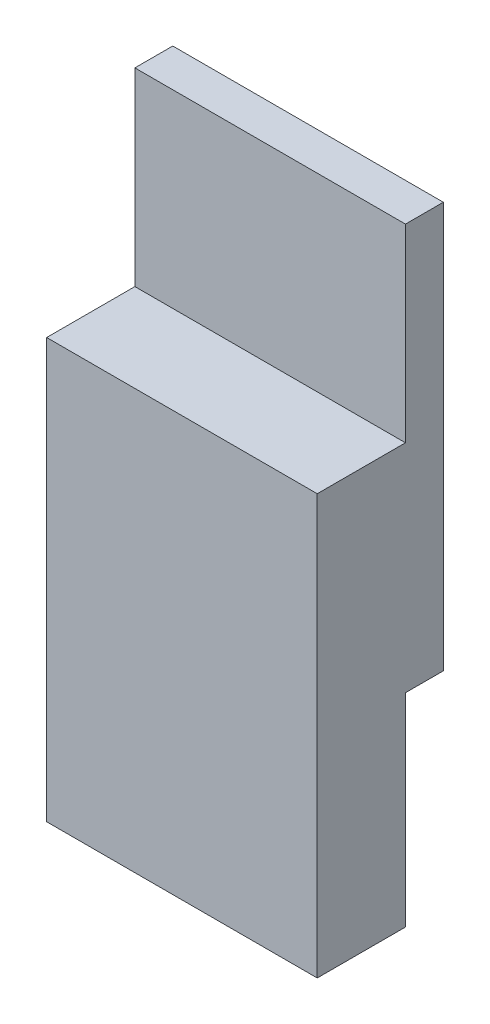
ISO-10303-21;
HEADER;
FILE_DESCRIPTION(('STEP AP214'),'2;1');
FILE_NAME('part.step','',(''),(''),'','','');
FILE_SCHEMA(('AUTOMOTIVE_DESIGN { 1 0 10303 214 1 1 1 1 }'));
ENDSEC;
DATA;
#1=APPLICATION_CONTEXT('core data for automotive mechanical design processes');
#2=APPLICATION_PROTOCOL_DEFINITION('international standard','automotive_design',2000,#1);
#3=PRODUCT_CONTEXT('',#1,'mechanical');
#4=PRODUCT('Part','Part','',(#3));
#5=PRODUCT_RELATED_PRODUCT_CATEGORY('part','',(#4));
#6=PRODUCT_DEFINITION_FORMATION('','',#4);
#7=PRODUCT_DEFINITION_CONTEXT('part definition',#1,'design');
#8=PRODUCT_DEFINITION('design','',#6,#7);
#9=PRODUCT_DEFINITION_SHAPE('','',#8);
#10=(LENGTH_UNIT() NAMED_UNIT(*) SI_UNIT(.MILLI.,.METRE.));
#11=(NAMED_UNIT(*) PLANE_ANGLE_UNIT() SI_UNIT($,.RADIAN.));
#12=(NAMED_UNIT(*) SI_UNIT($,.STERADIAN.) SOLID_ANGLE_UNIT());
#13=UNCERTAINTY_MEASURE_WITH_UNIT(LENGTH_MEASURE(1.E-05),#10,'distance_accuracy_value','');
#14=(GEOMETRIC_REPRESENTATION_CONTEXT(3) GLOBAL_UNCERTAINTY_ASSIGNED_CONTEXT((#13)) GLOBAL_UNIT_ASSIGNED_CONTEXT((#10,
#11,#12)) REPRESENTATION_CONTEXT('',''));
#15=CARTESIAN_POINT('',(0.,0.,0.));
#16=DIRECTION('',(0.,0.,1.));
#17=DIRECTION('',(1.,0.,0.));
#18=AXIS2_PLACEMENT_3D('',#15,#16,#17);
#19=CARTESIAN_POINT('',(-10.,7.49999999999999,1.4));
#20=DIRECTION('',(1.,0.,0.));
#21=DIRECTION('',(0.,1.,0.));
#22=AXIS2_PLACEMENT_3D('',#19,#20,#21);
#23=PLANE('',#22);
#24=DIRECTION('',(0.,-1.,0.));
#25=VECTOR('',#24,1.);
#26=CARTESIAN_POINT('',(-10.,7.49999999999999,0.));
#27=LINE('',#26,#25);
#28=CARTESIAN_POINT('',(-10.,7.49999999999999,0.));
#29=VERTEX_POINT('',#28);
#30=CARTESIAN_POINT('',(-10.,-7.5,0.));
#31=VERTEX_POINT('',#30);
#32=EDGE_CURVE('E128',#29,#31,#27,.T.);
#33=ORIENTED_EDGE('',*,*,#32,.T.);
#34=DIRECTION('',(0.,0.,-1.));
#35=VECTOR('',#34,1.);
#36=CARTESIAN_POINT('',(-10.,-7.5,1.4));
#37=LINE('',#36,#35);
#38=CARTESIAN_POINT('',(-10.,-7.5,1.4));
#39=VERTEX_POINT('',#38);
#40=EDGE_CURVE('E11',#39,#31,#37,.T.);
#41=ORIENTED_EDGE('',*,*,#40,.F.);
#42=DIRECTION('',(0.,-1.,0.));
#43=VECTOR('',#42,1.);
#44=CARTESIAN_POINT('',(-10.,0.499999999999993,1.4));
#45=LINE('',#44,#43);
#46=CARTESIAN_POINT('',(-10.,-15.,1.4));
#47=VERTEX_POINT('',#46);
#48=EDGE_CURVE('E126',#39,#47,#45,.T.);
#49=ORIENTED_EDGE('',*,*,#48,.T.);
#50=DIRECTION('',(0.,0.,-1.));
#51=VECTOR('',#50,1.);
#52=CARTESIAN_POINT('',(-10.,-15.,4.66));
#53=LINE('',#52,#51);
#54=CARTESIAN_POINT('',(-10.,-15.,4.66));
#55=VERTEX_POINT('',#54);
#56=EDGE_CURVE('E110',#55,#47,#53,.T.);
#57=ORIENTED_EDGE('',*,*,#56,.F.);
#58=DIRECTION('',(0.,-1.,0.));
#59=VECTOR('',#58,1.);
#60=CARTESIAN_POINT('',(-10.,0.499999999999993,4.66));
#61=LINE('',#60,#59);
#62=CARTESIAN_POINT('',(-10.,0.499999999999993,4.66));
#63=VERTEX_POINT('',#62);
#64=EDGE_CURVE('E116',#63,#55,#61,.T.);
#65=ORIENTED_EDGE('',*,*,#64,.F.);
#66=DIRECTION('',(0.,0.,-1.));
#67=VECTOR('',#66,1.);
#68=CARTESIAN_POINT('',(-10.,0.499999999999993,4.66));
#69=LINE('',#68,#67);
#70=CARTESIAN_POINT('',(-10.,0.499999999999993,1.4));
#71=VERTEX_POINT('',#70);
#72=EDGE_CURVE('E169',#63,#71,#69,.T.);
#73=ORIENTED_EDGE('',*,*,#72,.T.);
#74=DIRECTION('',(0.,-1.,0.));
#75=VECTOR('',#74,1.);
#76=CARTESIAN_POINT('',(-10.,7.49999999999999,1.4));
#77=LINE('',#76,#75);
#78=CARTESIAN_POINT('',(-10.,7.49999999999999,1.4));
#79=VERTEX_POINT('',#78);
#80=EDGE_CURVE('E136',#79,#71,#77,.T.);
#81=ORIENTED_EDGE('',*,*,#80,.F.);
#82=DIRECTION('',(0.,0.,-1.));
#83=VECTOR('',#82,1.);
#84=CARTESIAN_POINT('',(-10.,7.49999999999999,1.4));
#85=LINE('',#84,#83);
#86=EDGE_CURVE('E56',#79,#29,#85,.T.);
#87=ORIENTED_EDGE('',*,*,#86,.T.);
#88=EDGE_LOOP('',(#33,#41,#49,#57,#65,#73,#81,#87));
#89=FACE_BOUND('',#88,.T.);
#90=ADVANCED_FACE('F33',(#89),#23,.F.);
#91=CARTESIAN_POINT('',(-10.,-7.5,1.4));
#92=DIRECTION('',(0.,1.,0.));
#93=DIRECTION('',(0.,0.,1.));
#94=AXIS2_PLACEMENT_3D('',#91,#92,#93);
#95=PLANE('',#94);
#96=DIRECTION('',(1.,0.,0.));
#97=VECTOR('',#96,1.);
#98=CARTESIAN_POINT('',(-10.,-7.5,0.));
#99=LINE('',#98,#97);
#100=CARTESIAN_POINT('',(0.,-7.5,0.));
#101=VERTEX_POINT('',#100);
#102=EDGE_CURVE('E130',#31,#101,#99,.T.);
#103=ORIENTED_EDGE('',*,*,#102,.T.);
#104=DIRECTION('',(0.,0.,-1.));
#105=VECTOR('',#104,1.);
#106=CARTESIAN_POINT('',(0.,-7.5,1.4));
#107=LINE('',#106,#105);
#108=CARTESIAN_POINT('',(0.,-7.5,1.4));
#109=VERTEX_POINT('',#108);
#110=EDGE_CURVE('E40',#109,#101,#107,.T.);
#111=ORIENTED_EDGE('',*,*,#110,.F.);
#112=DIRECTION('',(1.,0.,0.));
#113=VECTOR('',#112,1.);
#114=CARTESIAN_POINT('',(-10.,-7.5,1.4));
#115=LINE('',#114,#113);
#116=EDGE_CURVE('E82',#39,#109,#115,.T.);
#117=ORIENTED_EDGE('',*,*,#116,.F.);
#118=ORIENTED_EDGE('',*,*,#40,.T.);
#119=EDGE_LOOP('',(#103,#111,#117,#118));
#120=FACE_BOUND('',#119,.T.);
#121=ADVANCED_FACE('F159',(#120),#95,.F.);
#122=CARTESIAN_POINT('',(0.,7.5,1.4));
#123=DIRECTION('',(1.,0.,0.));
#124=DIRECTION('',(0.,1.,0.));
#125=AXIS2_PLACEMENT_3D('',#122,#123,#124);
#126=PLANE('',#125);
#127=DIRECTION('',(0.,-1.,0.));
#128=VECTOR('',#127,1.);
#129=CARTESIAN_POINT('',(0.,7.5,0.));
#130=LINE('',#129,#128);
#131=CARTESIAN_POINT('',(0.,7.5,0.));
#132=VERTEX_POINT('',#131);
#133=EDGE_CURVE('E146',#132,#101,#130,.T.);
#134=ORIENTED_EDGE('',*,*,#133,.F.);
#135=DIRECTION('',(0.,0.,-1.));
#136=VECTOR('',#135,1.);
#137=CARTESIAN_POINT('',(0.,7.5,1.4));
#138=LINE('',#137,#136);
#139=CARTESIAN_POINT('',(0.,7.5,1.4));
#140=VERTEX_POINT('',#139);
#141=EDGE_CURVE('E152',#140,#132,#138,.T.);
#142=ORIENTED_EDGE('',*,*,#141,.F.);
#143=DIRECTION('',(0.,-1.,0.));
#144=VECTOR('',#143,1.);
#145=CARTESIAN_POINT('',(0.,7.5,1.4));
#146=LINE('',#145,#144);
#147=CARTESIAN_POINT('',(0.,0.499999999999993,1.4));
#148=VERTEX_POINT('',#147);
#149=EDGE_CURVE('E140',#140,#148,#146,.T.);
#150=ORIENTED_EDGE('',*,*,#149,.T.);
#151=DIRECTION('',(0.,0.,-1.));
#152=VECTOR('',#151,1.);
#153=CARTESIAN_POINT('',(0.,0.499999999999993,4.66));
#154=LINE('',#153,#152);
#155=CARTESIAN_POINT('',(0.,0.499999999999993,4.66));
#156=VERTEX_POINT('',#155);
#157=EDGE_CURVE('E132',#156,#148,#154,.T.);
#158=ORIENTED_EDGE('',*,*,#157,.F.);
#159=DIRECTION('',(0.,1.,0.));
#160=VECTOR('',#159,1.);
#161=CARTESIAN_POINT('',(0.,0.499999999999993,4.66));
#162=LINE('',#161,#160);
#163=CARTESIAN_POINT('',(0.,-15.,4.66));
#164=VERTEX_POINT('',#163);
#165=EDGE_CURVE('E115',#164,#156,#162,.T.);
#166=ORIENTED_EDGE('',*,*,#165,.F.);
#167=DIRECTION('',(0.,0.,-1.));
#168=VECTOR('',#167,1.);
#169=CARTESIAN_POINT('',(0.,-15.,4.66));
#170=LINE('',#169,#168);
#171=CARTESIAN_POINT('',(0.,-15.,1.4));
#172=VERTEX_POINT('',#171);
#173=EDGE_CURVE('E112',#164,#172,#170,.T.);
#174=ORIENTED_EDGE('',*,*,#173,.T.);
#175=DIRECTION('',(0.,1.,0.));
#176=VECTOR('',#175,1.);
#177=CARTESIAN_POINT('',(0.,0.499999999999993,1.4));
#178=LINE('',#177,#176);
#179=EDGE_CURVE('E158',#172,#109,#178,.T.);
#180=ORIENTED_EDGE('',*,*,#179,.T.);
#181=ORIENTED_EDGE('',*,*,#110,.T.);
#182=EDGE_LOOP('',(#134,#142,#150,#158,#166,#174,#180,#181));
#183=FACE_BOUND('',#182,.T.);
#184=ADVANCED_FACE('F156',(#183),#126,.T.);
#185=CARTESIAN_POINT('',(-10.,7.49999999999999,1.4));
#186=DIRECTION('',(0.,1.,0.));
#187=DIRECTION('',(-1.,0.,0.));
#188=AXIS2_PLACEMENT_3D('',#185,#186,#187);
#189=PLANE('',#188);
#190=DIRECTION('',(1.,0.,0.));
#191=VECTOR('',#190,1.);
#192=CARTESIAN_POINT('',(-10.,7.49999999999999,0.));
#193=LINE('',#192,#191);
#194=EDGE_CURVE('E138',#29,#132,#193,.T.);
#195=ORIENTED_EDGE('',*,*,#194,.F.);
#196=ORIENTED_EDGE('',*,*,#86,.F.);
#197=DIRECTION('',(1.,0.,0.));
#198=VECTOR('',#197,1.);
#199=CARTESIAN_POINT('',(-10.,7.49999999999999,1.4));
#200=LINE('',#199,#198);
#201=EDGE_CURVE('E142',#79,#140,#200,.T.);
#202=ORIENTED_EDGE('',*,*,#201,.T.);
#203=ORIENTED_EDGE('',*,*,#141,.T.);
#204=EDGE_LOOP('',(#195,#196,#202,#203));
#205=FACE_BOUND('',#204,.T.);
#206=ADVANCED_FACE('F162',(#205),#189,.T.);
#207=CARTESIAN_POINT('',(0.,0.,1.4));
#208=DIRECTION('',(0.,0.,1.));
#209=DIRECTION('',(1.,0.,0.));
#210=AXIS2_PLACEMENT_3D('',#207,#208,#209);
#211=PLANE('',#210);
#212=DIRECTION('',(-1.,0.,0.));
#213=VECTOR('',#212,1.);
#214=CARTESIAN_POINT('',(-10.,0.499999999999993,1.4));
#215=LINE('',#214,#213);
#216=EDGE_CURVE('E47',#148,#71,#215,.T.);
#217=ORIENTED_EDGE('',*,*,#216,.F.);
#218=ORIENTED_EDGE('',*,*,#149,.F.);
#219=ORIENTED_EDGE('',*,*,#201,.F.);
#220=ORIENTED_EDGE('',*,*,#80,.T.);
#221=EDGE_LOOP('',(#217,#218,#219,#220));
#222=FACE_BOUND('',#221,.T.);
#223=ADVANCED_FACE('F166',(#222),#211,.T.);
#224=CARTESIAN_POINT('',(0.,0.,0.));
#225=DIRECTION('',(0.,0.,1.));
#226=DIRECTION('',(1.,0.,0.));
#227=AXIS2_PLACEMENT_3D('',#224,#225,#226);
#228=PLANE('',#227);
#229=ORIENTED_EDGE('',*,*,#32,.F.);
#230=ORIENTED_EDGE('',*,*,#194,.T.);
#231=ORIENTED_EDGE('',*,*,#133,.T.);
#232=ORIENTED_EDGE('',*,*,#102,.F.);
#233=EDGE_LOOP('',(#229,#230,#231,#232));
#234=FACE_BOUND('',#233,.T.);
#235=ADVANCED_FACE('F161',(#234),#228,.F.);
#236=CARTESIAN_POINT('',(0.,0.,1.4));
#237=DIRECTION('',(0.,0.,1.));
#238=DIRECTION('',(1.,0.,0.));
#239=AXIS2_PLACEMENT_3D('',#236,#237,#238);
#240=PLANE('',#239);
#241=ORIENTED_EDGE('',*,*,#48,.F.);
#242=ORIENTED_EDGE('',*,*,#116,.T.);
#243=ORIENTED_EDGE('',*,*,#179,.F.);
#244=DIRECTION('',(1.,0.,0.));
#245=VECTOR('',#244,1.);
#246=CARTESIAN_POINT('',(-10.,-15.,1.4));
#247=LINE('',#246,#245);
#248=EDGE_CURVE('E175',#47,#172,#247,.T.);
#249=ORIENTED_EDGE('',*,*,#248,.F.);
#250=EDGE_LOOP('',(#241,#242,#243,#249));
#251=FACE_BOUND('',#250,.T.);
#252=ADVANCED_FACE('F179',(#251),#240,.F.);
#253=CARTESIAN_POINT('',(-10.,-15.,4.66));
#254=DIRECTION('',(0.,1.,0.));
#255=DIRECTION('',(-1.,0.,0.));
#256=AXIS2_PLACEMENT_3D('',#253,#254,#255);
#257=PLANE('',#256);
#258=ORIENTED_EDGE('',*,*,#248,.T.);
#259=ORIENTED_EDGE('',*,*,#173,.F.);
#260=DIRECTION('',(1.,0.,0.));
#261=VECTOR('',#260,1.);
#262=CARTESIAN_POINT('',(-10.,-15.,4.66));
#263=LINE('',#262,#261);
#264=EDGE_CURVE('E106',#55,#164,#263,.T.);
#265=ORIENTED_EDGE('',*,*,#264,.F.);
#266=ORIENTED_EDGE('',*,*,#56,.T.);
#267=EDGE_LOOP('',(#258,#259,#265,#266));
#268=FACE_BOUND('',#267,.T.);
#269=ADVANCED_FACE('F108',(#268),#257,.F.);
#270=CARTESIAN_POINT('',(-10.,0.499999999999993,4.66));
#271=DIRECTION('',(0.,-1.,0.));
#272=DIRECTION('',(0.,0.,-1.));
#273=AXIS2_PLACEMENT_3D('',#270,#271,#272);
#274=PLANE('',#273);
#275=ORIENTED_EDGE('',*,*,#216,.T.);
#276=ORIENTED_EDGE('',*,*,#72,.F.);
#277=DIRECTION('',(-1.,0.,0.));
#278=VECTOR('',#277,1.);
#279=CARTESIAN_POINT('',(-10.,0.499999999999993,4.66));
#280=LINE('',#279,#278);
#281=EDGE_CURVE('E121',#156,#63,#280,.T.);
#282=ORIENTED_EDGE('',*,*,#281,.F.);
#283=ORIENTED_EDGE('',*,*,#157,.T.);
#284=EDGE_LOOP('',(#275,#276,#282,#283));
#285=FACE_BOUND('',#284,.T.);
#286=ADVANCED_FACE('F168',(#285),#274,.F.);
#287=CARTESIAN_POINT('',(0.,0.,4.66));
#288=DIRECTION('',(0.,0.,1.));
#289=DIRECTION('',(1.,0.,0.));
#290=AXIS2_PLACEMENT_3D('',#287,#288,#289);
#291=PLANE('',#290);
#292=ORIENTED_EDGE('',*,*,#64,.T.);
#293=ORIENTED_EDGE('',*,*,#264,.T.);
#294=ORIENTED_EDGE('',*,*,#165,.T.);
#295=ORIENTED_EDGE('',*,*,#281,.T.);
#296=EDGE_LOOP('',(#292,#293,#294,#295));
#297=FACE_BOUND('',#296,.T.);
#298=ADVANCED_FACE('F119',(#297),#291,.T.);
#299=CLOSED_SHELL('',(#90,#121,#184,#206,#223,#235,#252,#269,#286,#298));
#300=MANIFOLD_SOLID_BREP('B2',#299);
#301=ADVANCED_BREP_SHAPE_REPRESENTATION('',(#18,#300),#14);
#302=SHAPE_DEFINITION_REPRESENTATION(#9,#301);
ENDSEC;
END-ISO-10303-21;
